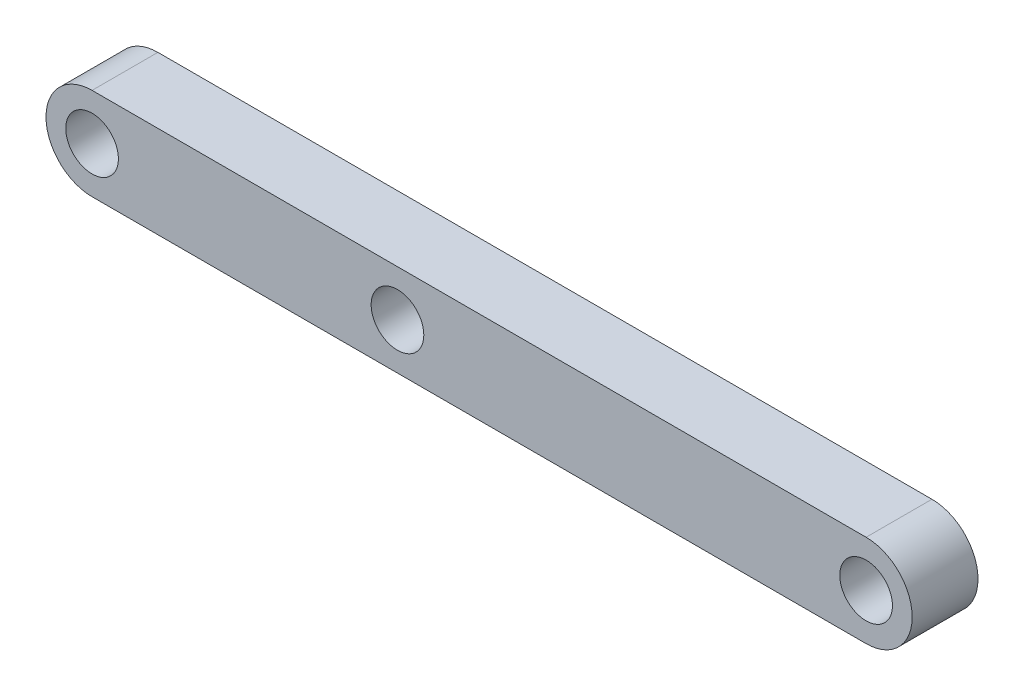
ISO-10303-21;
HEADER;
FILE_DESCRIPTION(('STEP AP214'),'2;1');
FILE_NAME('part.step','',(''),(''),'','','');
FILE_SCHEMA(('AUTOMOTIVE_DESIGN { 1 0 10303 214 1 1 1 1 }'));
ENDSEC;
DATA;
#1=APPLICATION_CONTEXT('core data for automotive mechanical design processes');
#2=APPLICATION_PROTOCOL_DEFINITION('international standard','automotive_design',2000,#1);
#3=PRODUCT_CONTEXT('',#1,'mechanical');
#4=PRODUCT('Part','Part','',(#3));
#5=PRODUCT_RELATED_PRODUCT_CATEGORY('part','',(#4));
#6=PRODUCT_DEFINITION_FORMATION('','',#4);
#7=PRODUCT_DEFINITION_CONTEXT('part definition',#1,'design');
#8=PRODUCT_DEFINITION('design','',#6,#7);
#9=PRODUCT_DEFINITION_SHAPE('','',#8);
#10=(LENGTH_UNIT() NAMED_UNIT(*) SI_UNIT(.MILLI.,.METRE.));
#11=(NAMED_UNIT(*) PLANE_ANGLE_UNIT() SI_UNIT($,.RADIAN.));
#12=(NAMED_UNIT(*) SI_UNIT($,.STERADIAN.) SOLID_ANGLE_UNIT());
#13=UNCERTAINTY_MEASURE_WITH_UNIT(LENGTH_MEASURE(1.E-05),#10,'distance_accuracy_value','');
#14=(GEOMETRIC_REPRESENTATION_CONTEXT(3) GLOBAL_UNCERTAINTY_ASSIGNED_CONTEXT((#13)) GLOBAL_UNIT_ASSIGNED_CONTEXT((#10,
#11,#12)) REPRESENTATION_CONTEXT('',''));
#15=CARTESIAN_POINT('',(0.,0.,0.));
#16=DIRECTION('',(0.,0.,1.));
#17=DIRECTION('',(1.,0.,0.));
#18=AXIS2_PLACEMENT_3D('',#15,#16,#17);
#19=CARTESIAN_POINT('',(0.,35.,50.));
#20=DIRECTION('',(0.,1.,0.));
#21=DIRECTION('',(-1.,0.,0.));
#22=AXIS2_PLACEMENT_3D('',#19,#20,#21);
#23=PLANE('',#22);
#24=DIRECTION('',(1.,0.,0.));
#25=VECTOR('',#24,1.);
#26=CARTESIAN_POINT('',(0.,35.,0.));
#27=LINE('',#26,#25);
#28=CARTESIAN_POINT('',(0.,35.,0.));
#29=VERTEX_POINT('',#28);
#30=CARTESIAN_POINT('',(588.,35.,0.));
#31=VERTEX_POINT('',#30);
#32=EDGE_CURVE('E118',#29,#31,#27,.T.);
#33=ORIENTED_EDGE('',*,*,#32,.F.);
#34=DIRECTION('',(0.,0.,-1.));
#35=VECTOR('',#34,1.);
#36=CARTESIAN_POINT('',(0.,35.,50.));
#37=LINE('',#36,#35);
#38=CARTESIAN_POINT('',(0.,35.,50.));
#39=VERTEX_POINT('',#38);
#40=EDGE_CURVE('E11',#39,#29,#37,.T.);
#41=ORIENTED_EDGE('',*,*,#40,.F.);
#42=DIRECTION('',(1.,0.,0.));
#43=VECTOR('',#42,1.);
#44=CARTESIAN_POINT('',(0.,35.,50.));
#45=LINE('',#44,#43);
#46=CARTESIAN_POINT('',(588.,35.,50.));
#47=VERTEX_POINT('',#46);
#48=EDGE_CURVE('E105',#39,#47,#45,.T.);
#49=ORIENTED_EDGE('',*,*,#48,.T.);
#50=DIRECTION('',(0.,0.,-1.));
#51=VECTOR('',#50,1.);
#52=CARTESIAN_POINT('',(588.,35.,50.));
#53=LINE('',#52,#51);
#54=EDGE_CURVE('E84',#47,#31,#53,.T.);
#55=ORIENTED_EDGE('',*,*,#54,.T.);
#56=EDGE_LOOP('',(#33,#41,#49,#55));
#57=FACE_BOUND('',#56,.T.);
#58=ADVANCED_FACE('F44',(#57),#23,.T.);
#59=CARTESIAN_POINT('',(0.,0.,50.));
#60=DIRECTION('',(0.,0.,-1.));
#61=DIRECTION('',(-1.,0.,0.));
#62=AXIS2_PLACEMENT_3D('',#59,#60,#61);
#63=CYLINDRICAL_SURFACE('',#62,35.);
#64=CARTESIAN_POINT('',(0.,0.,0.));
#65=DIRECTION('',(0.,0.,1.));
#66=DIRECTION('',(1.,0.,0.));
#67=AXIS2_PLACEMENT_3D('',#64,#65,#66);
#68=CIRCLE('',#67,35.);
#69=CARTESIAN_POINT('',(0.,-35.,0.));
#70=VERTEX_POINT('',#69);
#71=EDGE_CURVE('E110',#29,#70,#68,.T.);
#72=ORIENTED_EDGE('',*,*,#71,.T.);
#73=DIRECTION('',(0.,0.,-1.));
#74=VECTOR('',#73,1.);
#75=CARTESIAN_POINT('',(0.,-35.,50.));
#76=LINE('',#75,#74);
#77=CARTESIAN_POINT('',(0.,-35.,50.));
#78=VERTEX_POINT('',#77);
#79=EDGE_CURVE('E53',#78,#70,#76,.T.);
#80=ORIENTED_EDGE('',*,*,#79,.F.);
#81=CARTESIAN_POINT('',(0.,0.,50.));
#82=DIRECTION('',(0.,0.,1.));
#83=DIRECTION('',(1.,0.,0.));
#84=AXIS2_PLACEMENT_3D('',#81,#82,#83);
#85=CIRCLE('',#84,35.);
#86=EDGE_CURVE('E97',#39,#78,#85,.T.);
#87=ORIENTED_EDGE('',*,*,#86,.F.);
#88=ORIENTED_EDGE('',*,*,#40,.T.);
#89=EDGE_LOOP('',(#72,#80,#87,#88));
#90=FACE_BOUND('',#89,.T.);
#91=ADVANCED_FACE('F104',(#90),#63,.T.);
#92=CARTESIAN_POINT('',(0.,-35.,50.));
#93=DIRECTION('',(0.,1.,0.));
#94=DIRECTION('',(-1.,0.,0.));
#95=AXIS2_PLACEMENT_3D('',#92,#93,#94);
#96=PLANE('',#95);
#97=DIRECTION('',(1.,0.,0.));
#98=VECTOR('',#97,1.);
#99=CARTESIAN_POINT('',(0.,-35.,0.));
#100=LINE('',#99,#98);
#101=CARTESIAN_POINT('',(588.,-35.,0.));
#102=VERTEX_POINT('',#101);
#103=EDGE_CURVE('E114',#70,#102,#100,.T.);
#104=ORIENTED_EDGE('',*,*,#103,.T.);
#105=DIRECTION('',(0.,0.,-1.));
#106=VECTOR('',#105,1.);
#107=CARTESIAN_POINT('',(588.,-35.,50.));
#108=LINE('',#107,#106);
#109=CARTESIAN_POINT('',(588.,-35.,50.));
#110=VERTEX_POINT('',#109);
#111=EDGE_CURVE('E98',#110,#102,#108,.T.);
#112=ORIENTED_EDGE('',*,*,#111,.F.);
#113=DIRECTION('',(1.,0.,0.));
#114=VECTOR('',#113,1.);
#115=CARTESIAN_POINT('',(0.,-35.,50.));
#116=LINE('',#115,#114);
#117=EDGE_CURVE('E95',#78,#110,#116,.T.);
#118=ORIENTED_EDGE('',*,*,#117,.F.);
#119=ORIENTED_EDGE('',*,*,#79,.T.);
#120=EDGE_LOOP('',(#104,#112,#118,#119));
#121=FACE_BOUND('',#120,.T.);
#122=ADVANCED_FACE('F92',(#121),#96,.F.);
#123=CARTESIAN_POINT('',(0.,0.,50.));
#124=DIRECTION('',(0.,0.,-1.));
#125=DIRECTION('',(-1.,0.,0.));
#126=AXIS2_PLACEMENT_3D('',#123,#124,#125);
#127=CYLINDRICAL_SURFACE('',#126,20.);
#128=CARTESIAN_POINT('',(0.,0.,50.));
#129=DIRECTION('',(0.,0.,1.));
#130=DIRECTION('',(1.,0.,0.));
#131=AXIS2_PLACEMENT_3D('',#128,#129,#130);
#132=CIRCLE('',#131,20.);
#133=CARTESIAN_POINT('',(20.,0.,50.));
#134=VERTEX_POINT('',#133);
#135=EDGE_CURVE('E129',#134,#134,#132,.T.);
#136=ORIENTED_EDGE('',*,*,#135,.T.);
#137=EDGE_LOOP('',(#136));
#138=FACE_BOUND('',#137,.T.);
#139=CARTESIAN_POINT('',(0.,0.,0.));
#140=DIRECTION('',(0.,0.,1.));
#141=DIRECTION('',(1.,0.,0.));
#142=AXIS2_PLACEMENT_3D('',#139,#140,#141);
#143=CIRCLE('',#142,20.);
#144=CARTESIAN_POINT('',(20.,0.,0.));
#145=VERTEX_POINT('',#144);
#146=EDGE_CURVE('E116',#145,#145,#143,.T.);
#147=ORIENTED_EDGE('',*,*,#146,.F.);
#148=EDGE_LOOP('',(#147));
#149=FACE_BOUND('',#148,.T.);
#150=ADVANCED_FACE('F149',(#138,#149),#127,.F.);
#151=CARTESIAN_POINT('',(232.,0.,50.));
#152=DIRECTION('',(0.,0.,-1.));
#153=DIRECTION('',(-1.,0.,0.));
#154=AXIS2_PLACEMENT_3D('',#151,#152,#153);
#155=CYLINDRICAL_SURFACE('',#154,20.);
#156=CARTESIAN_POINT('',(232.,0.,50.));
#157=DIRECTION('',(0.,0.,1.));
#158=DIRECTION('',(1.,0.,0.));
#159=AXIS2_PLACEMENT_3D('',#156,#157,#158);
#160=CIRCLE('',#159,20.);
#161=CARTESIAN_POINT('',(252.,0.,50.));
#162=VERTEX_POINT('',#161);
#163=EDGE_CURVE('E135',#162,#162,#160,.T.);
#164=ORIENTED_EDGE('',*,*,#163,.T.);
#165=EDGE_LOOP('',(#164));
#166=FACE_BOUND('',#165,.T.);
#167=CARTESIAN_POINT('',(232.,0.,0.));
#168=DIRECTION('',(0.,0.,1.));
#169=DIRECTION('',(1.,0.,0.));
#170=AXIS2_PLACEMENT_3D('',#167,#168,#169);
#171=CIRCLE('',#170,20.);
#172=CARTESIAN_POINT('',(252.,0.,0.));
#173=VERTEX_POINT('',#172);
#174=EDGE_CURVE('E123',#173,#173,#171,.T.);
#175=ORIENTED_EDGE('',*,*,#174,.F.);
#176=EDGE_LOOP('',(#175));
#177=FACE_BOUND('',#176,.T.);
#178=ADVANCED_FACE('F155',(#166,#177),#155,.F.);
#179=CARTESIAN_POINT('',(588.,0.,50.));
#180=DIRECTION('',(0.,0.,-1.));
#181=DIRECTION('',(-1.,0.,0.));
#182=AXIS2_PLACEMENT_3D('',#179,#180,#181);
#183=CYLINDRICAL_SURFACE('',#182,20.);
#184=CARTESIAN_POINT('',(588.,0.,50.));
#185=DIRECTION('',(0.,0.,1.));
#186=DIRECTION('',(1.,0.,0.));
#187=AXIS2_PLACEMENT_3D('',#184,#185,#186);
#188=CIRCLE('',#187,20.);
#189=CARTESIAN_POINT('',(608.,0.,50.));
#190=VERTEX_POINT('',#189);
#191=EDGE_CURVE('E115',#190,#190,#188,.T.);
#192=ORIENTED_EDGE('',*,*,#191,.T.);
#193=EDGE_LOOP('',(#192));
#194=FACE_BOUND('',#193,.T.);
#195=CARTESIAN_POINT('',(588.,0.,0.));
#196=DIRECTION('',(0.,0.,1.));
#197=DIRECTION('',(1.,0.,0.));
#198=AXIS2_PLACEMENT_3D('',#195,#196,#197);
#199=CIRCLE('',#198,20.);
#200=CARTESIAN_POINT('',(608.,0.,0.));
#201=VERTEX_POINT('',#200);
#202=EDGE_CURVE('E124',#201,#201,#199,.T.);
#203=ORIENTED_EDGE('',*,*,#202,.F.);
#204=EDGE_LOOP('',(#203));
#205=FACE_BOUND('',#204,.T.);
#206=ADVANCED_FACE('F50',(#194,#205),#183,.F.);
#207=CARTESIAN_POINT('',(588.,0.,50.));
#208=DIRECTION('',(0.,0.,-1.));
#209=DIRECTION('',(-1.,0.,0.));
#210=AXIS2_PLACEMENT_3D('',#207,#208,#209);
#211=CYLINDRICAL_SURFACE('',#210,35.);
#212=CARTESIAN_POINT('',(588.,0.,0.));
#213=DIRECTION('',(0.,0.,1.));
#214=DIRECTION('',(1.,0.,0.));
#215=AXIS2_PLACEMENT_3D('',#212,#213,#214);
#216=CIRCLE('',#215,35.);
#217=EDGE_CURVE('E80',#102,#31,#216,.T.);
#218=ORIENTED_EDGE('',*,*,#217,.T.);
#219=ORIENTED_EDGE('',*,*,#54,.F.);
#220=CARTESIAN_POINT('',(588.,0.,50.));
#221=DIRECTION('',(0.,0.,1.));
#222=DIRECTION('',(1.,0.,0.));
#223=AXIS2_PLACEMENT_3D('',#220,#221,#222);
#224=CIRCLE('',#223,35.);
#225=EDGE_CURVE('E65',#110,#47,#224,.T.);
#226=ORIENTED_EDGE('',*,*,#225,.F.);
#227=ORIENTED_EDGE('',*,*,#111,.T.);
#228=EDGE_LOOP('',(#218,#219,#226,#227));
#229=FACE_BOUND('',#228,.T.);
#230=ADVANCED_FACE('F141',(#229),#211,.T.);
#231=CARTESIAN_POINT('',(0.,0.,50.));
#232=DIRECTION('',(0.,0.,1.));
#233=DIRECTION('',(1.,0.,0.));
#234=AXIS2_PLACEMENT_3D('',#231,#232,#233);
#235=PLANE('',#234);
#236=ORIENTED_EDGE('',*,*,#191,.F.);
#237=EDGE_LOOP('',(#236));
#238=FACE_BOUND('',#237,.T.);
#239=ORIENTED_EDGE('',*,*,#163,.F.);
#240=EDGE_LOOP('',(#239));
#241=FACE_BOUND('',#240,.T.);
#242=ORIENTED_EDGE('',*,*,#135,.F.);
#243=EDGE_LOOP('',(#242));
#244=FACE_BOUND('',#243,.T.);
#245=ORIENTED_EDGE('',*,*,#48,.F.);
#246=ORIENTED_EDGE('',*,*,#86,.T.);
#247=ORIENTED_EDGE('',*,*,#117,.T.);
#248=ORIENTED_EDGE('',*,*,#225,.T.);
#249=EDGE_LOOP('',(#245,#246,#247,#248));
#250=FACE_BOUND('',#249,.T.);
#251=ADVANCED_FACE('F101',(#238,#241,#244,#250),#235,.T.);
#252=CARTESIAN_POINT('',(0.,0.,0.));
#253=DIRECTION('',(0.,0.,1.));
#254=DIRECTION('',(1.,0.,0.));
#255=AXIS2_PLACEMENT_3D('',#252,#253,#254);
#256=PLANE('',#255);
#257=ORIENTED_EDGE('',*,*,#202,.T.);
#258=EDGE_LOOP('',(#257));
#259=FACE_BOUND('',#258,.T.);
#260=ORIENTED_EDGE('',*,*,#174,.T.);
#261=EDGE_LOOP('',(#260));
#262=FACE_BOUND('',#261,.T.);
#263=ORIENTED_EDGE('',*,*,#146,.T.);
#264=EDGE_LOOP('',(#263));
#265=FACE_BOUND('',#264,.T.);
#266=ORIENTED_EDGE('',*,*,#32,.T.);
#267=ORIENTED_EDGE('',*,*,#217,.F.);
#268=ORIENTED_EDGE('',*,*,#103,.F.);
#269=ORIENTED_EDGE('',*,*,#71,.F.);
#270=EDGE_LOOP('',(#266,#267,#268,#269));
#271=FACE_BOUND('',#270,.T.);
#272=ADVANCED_FACE('F142',(#259,#262,#265,#271),#256,.F.);
#273=CLOSED_SHELL('',(#58,#91,#122,#150,#178,#206,#230,#251,#272));
#274=MANIFOLD_SOLID_BREP('B2',#273);
#275=ADVANCED_BREP_SHAPE_REPRESENTATION('',(#18,#274),#14);
#276=SHAPE_DEFINITION_REPRESENTATION(#9,#275);
ENDSEC;
END-ISO-10303-21;
